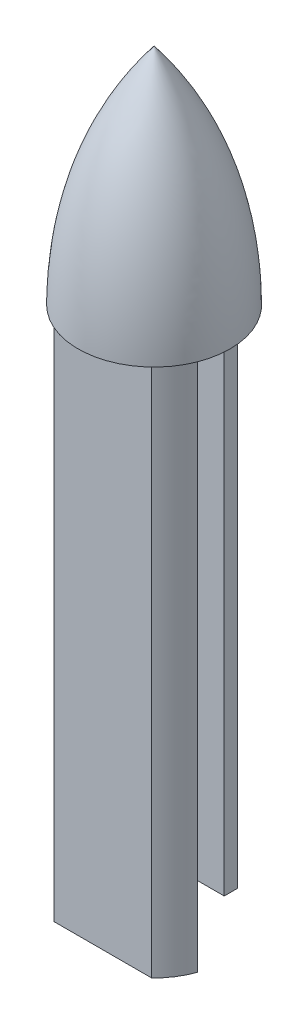
ISO-10303-21;
HEADER;
FILE_DESCRIPTION(('STEP AP214'),'2;1');
FILE_NAME('part.step','',(''),(''),'','','');
FILE_SCHEMA(('AUTOMOTIVE_DESIGN { 1 0 10303 214 1 1 1 1 }'));
ENDSEC;
DATA;
#1=APPLICATION_CONTEXT('core data for automotive mechanical design processes');
#2=APPLICATION_PROTOCOL_DEFINITION('international standard','automotive_design',2000,#1);
#3=PRODUCT_CONTEXT('',#1,'mechanical');
#4=PRODUCT('Part','Part','',(#3));
#5=PRODUCT_RELATED_PRODUCT_CATEGORY('part','',(#4));
#6=PRODUCT_DEFINITION_FORMATION('','',#4);
#7=PRODUCT_DEFINITION_CONTEXT('part definition',#1,'design');
#8=PRODUCT_DEFINITION('design','',#6,#7);
#9=PRODUCT_DEFINITION_SHAPE('','',#8);
#10=(LENGTH_UNIT() NAMED_UNIT(*) SI_UNIT(.MILLI.,.METRE.));
#11=(NAMED_UNIT(*) PLANE_ANGLE_UNIT() SI_UNIT($,.RADIAN.));
#12=(NAMED_UNIT(*) SI_UNIT($,.STERADIAN.) SOLID_ANGLE_UNIT());
#13=UNCERTAINTY_MEASURE_WITH_UNIT(LENGTH_MEASURE(1.E-05),#10,'distance_accuracy_value','');
#14=(GEOMETRIC_REPRESENTATION_CONTEXT(3) GLOBAL_UNCERTAINTY_ASSIGNED_CONTEXT((#13)) GLOBAL_UNIT_ASSIGNED_CONTEXT((#10,
#11,#12)) REPRESENTATION_CONTEXT('',''));
#15=CARTESIAN_POINT('',(0.,0.,0.));
#16=DIRECTION('',(0.,0.,1.));
#17=DIRECTION('',(1.,0.,0.));
#18=AXIS2_PLACEMENT_3D('',#15,#16,#17);
#19=CARTESIAN_POINT('',(0.,-190.,0.));
#20=DIRECTION('',(0.,1.,0.));
#21=DIRECTION('',(0.,0.,1.));
#22=AXIS2_PLACEMENT_3D('',#19,#20,#21);
#23=CYLINDRICAL_SURFACE('',#22,25.2);
#24=CARTESIAN_POINT('',(0.,-190.,0.));
#25=DIRECTION('',(0.,-1.,0.));
#26=DIRECTION('',(0.,0.,-1.));
#27=AXIS2_PLACEMENT_3D('',#24,#25,#26);
#28=CIRCLE('',#27,25.2);
#29=CARTESIAN_POINT('',(-17.3774998201698,-190.,18.25));
#30=VERTEX_POINT('',#29);
#31=CARTESIAN_POINT('',(-23.8112893393029,-190.,8.24999999999999));
#32=VERTEX_POINT('',#31);
#33=EDGE_CURVE('E127',#30,#32,#28,.T.);
#34=ORIENTED_EDGE('',*,*,#33,.F.);
#35=DIRECTION('',(0.,-1.,0.));
#36=VECTOR('',#35,1.);
#37=CARTESIAN_POINT('',(-17.3774998201698,60.214581284378,18.25));
#38=LINE('',#37,#36);
#39=CARTESIAN_POINT('',(-17.3774998201698,0.,18.25));
#40=VERTEX_POINT('',#39);
#41=EDGE_CURVE('E56',#40,#30,#38,.T.);
#42=ORIENTED_EDGE('',*,*,#41,.F.);
#43=CARTESIAN_POINT('',(0.,0.,0.));
#44=DIRECTION('',(0.,-1.,0.));
#45=DIRECTION('',(0.,0.,-1.));
#46=AXIS2_PLACEMENT_3D('',#43,#44,#45);
#47=CIRCLE('',#46,25.2);
#48=CARTESIAN_POINT('',(-23.8112893393029,0.,8.24999999999999));
#49=VERTEX_POINT('',#48);
#50=EDGE_CURVE('E137',#40,#49,#47,.T.);
#51=ORIENTED_EDGE('',*,*,#50,.T.);
#52=DIRECTION('',(0.,-1.,0.));
#53=VECTOR('',#52,1.);
#54=CARTESIAN_POINT('',(-23.8112893393029,60.214581284378,8.24999999999999));
#55=LINE('',#54,#53);
#56=EDGE_CURVE('E163',#49,#32,#55,.T.);
#57=ORIENTED_EDGE('',*,*,#56,.T.);
#58=EDGE_LOOP('',(#34,#42,#51,#57));
#59=FACE_BOUND('',#58,.T.);
#60=ADVANCED_FACE('F41',(#59),#23,.T.);
#61=DIRECTION('',(0.,-1.,0.));
#62=VECTOR('',#61,1.);
#63=CARTESIAN_POINT('',(-5.,60.214581284378,-24.6989878335125));
#64=LINE('',#63,#62);
#65=CARTESIAN_POINT('',(-5.,0.,-24.6989878335125));
#66=VERTEX_POINT('',#65);
#67=CARTESIAN_POINT('',(-5.,-190.,-24.6989878335125));
#68=VERTEX_POINT('',#67);
#69=EDGE_CURVE('E162',#66,#68,#64,.T.);
#70=ORIENTED_EDGE('',*,*,#69,.F.);
#71=CARTESIAN_POINT('',(5.00000000000001,0.,-24.6989878335125));
#72=VERTEX_POINT('',#71);
#73=EDGE_CURVE('E138',#66,#72,#47,.T.);
#74=ORIENTED_EDGE('',*,*,#73,.T.);
#75=DIRECTION('',(0.,-1.,0.));
#76=VECTOR('',#75,1.);
#77=CARTESIAN_POINT('',(5.00000000000001,60.214581284378,-24.6989878335125));
#78=LINE('',#77,#76);
#79=CARTESIAN_POINT('',(5.00000000000001,-190.,-24.6989878335125));
#80=VERTEX_POINT('',#79);
#81=EDGE_CURVE('E167',#72,#80,#78,.T.);
#82=ORIENTED_EDGE('',*,*,#81,.T.);
#83=EDGE_CURVE('E129',#68,#80,#28,.T.);
#84=ORIENTED_EDGE('',*,*,#83,.F.);
#85=EDGE_LOOP('',(#70,#74,#82,#84));
#86=FACE_BOUND('',#85,.T.);
#87=ADVANCED_FACE('F182',(#86),#23,.T.);
#88=CARTESIAN_POINT('',(0.,-190.,0.));
#89=DIRECTION('',(0.,-1.,0.));
#90=DIRECTION('',(0.,0.,-1.));
#91=AXIS2_PLACEMENT_3D('',#88,#89,#90);
#92=PLANE('',#91);
#93=DIRECTION('',(1.,0.,0.));
#94=VECTOR('',#93,1.);
#95=CARTESIAN_POINT('',(0.,-190.,-20.));
#96=LINE('',#95,#94);
#97=CARTESIAN_POINT('',(-5.,-190.,-20.));
#98=VERTEX_POINT('',#97);
#99=CARTESIAN_POINT('',(5.00000000000001,-190.,-20.));
#100=VERTEX_POINT('',#99);
#101=EDGE_CURVE('E156',#98,#100,#96,.T.);
#102=ORIENTED_EDGE('',*,*,#101,.F.);
#103=DIRECTION('',(0.,0.,-1.));
#104=VECTOR('',#103,1.);
#105=CARTESIAN_POINT('',(-5.00000000000001,-190.,0.));
#106=LINE('',#105,#104);
#107=EDGE_CURVE('E154',#98,#68,#106,.T.);
#108=ORIENTED_EDGE('',*,*,#107,.T.);
#109=ORIENTED_EDGE('',*,*,#83,.T.);
#110=DIRECTION('',(0.,0.,-1.));
#111=VECTOR('',#110,1.);
#112=CARTESIAN_POINT('',(5.00000000000001,-190.,0.));
#113=LINE('',#112,#111);
#114=EDGE_CURVE('E159',#100,#80,#113,.T.);
#115=ORIENTED_EDGE('',*,*,#114,.F.);
#116=EDGE_LOOP('',(#102,#108,#109,#115));
#117=FACE_BOUND('',#116,.T.);
#118=ADVANCED_FACE('F187',(#117),#92,.T.);
#119=CARTESIAN_POINT('',(0.,0.,0.));
#120=DIRECTION('',(0.,-1.,0.));
#121=DIRECTION('',(0.,0.,-1.));
#122=AXIS2_PLACEMENT_3D('',#119,#120,#121);
#123=PLANE('',#122);
#124=CARTESIAN_POINT('',(23.8112893393029,0.,8.24999999999999));
#125=VERTEX_POINT('',#124);
#126=CARTESIAN_POINT('',(17.3774998201698,0.,18.25));
#127=VERTEX_POINT('',#126);
#128=EDGE_CURVE('E122',#125,#127,#47,.T.);
#129=ORIENTED_EDGE('',*,*,#128,.F.);
#130=DIRECTION('',(1.,0.,0.));
#131=VECTOR('',#130,1.);
#132=CARTESIAN_POINT('',(0.,0.,8.24999999999999));
#133=LINE('',#132,#131);
#134=EDGE_CURVE('E115',#49,#125,#133,.T.);
#135=ORIENTED_EDGE('',*,*,#134,.F.);
#136=ORIENTED_EDGE('',*,*,#50,.F.);
#137=DIRECTION('',(-1.,0.,0.));
#138=VECTOR('',#137,1.);
#139=CARTESIAN_POINT('',(0.,0.,18.25));
#140=LINE('',#139,#138);
#141=EDGE_CURVE('E123',#127,#40,#140,.T.);
#142=ORIENTED_EDGE('',*,*,#141,.F.);
#143=EDGE_LOOP('',(#129,#135,#136,#142));
#144=FACE_BOUND('',#143,.T.);
#145=DIRECTION('',(0.,0.,1.));
#146=VECTOR('',#145,1.);
#147=CARTESIAN_POINT('',(5.00000000000001,0.,0.));
#148=LINE('',#147,#146);
#149=CARTESIAN_POINT('',(5.00000000000001,0.,-20.));
#150=VERTEX_POINT('',#149);
#151=EDGE_CURVE('E150',#72,#150,#148,.T.);
#152=ORIENTED_EDGE('',*,*,#151,.F.);
#153=ORIENTED_EDGE('',*,*,#73,.F.);
#154=DIRECTION('',(0.,0.,1.));
#155=VECTOR('',#154,1.);
#156=CARTESIAN_POINT('',(-5.00000000000001,0.,0.));
#157=LINE('',#156,#155);
#158=CARTESIAN_POINT('',(-5.,0.,-20.));
#159=VERTEX_POINT('',#158);
#160=EDGE_CURVE('E151',#66,#159,#157,.T.);
#161=ORIENTED_EDGE('',*,*,#160,.T.);
#162=DIRECTION('',(-1.,0.,0.));
#163=VECTOR('',#162,1.);
#164=CARTESIAN_POINT('',(0.,0.,-20.));
#165=LINE('',#164,#163);
#166=EDGE_CURVE('E148',#150,#159,#165,.T.);
#167=ORIENTED_EDGE('',*,*,#166,.F.);
#168=EDGE_LOOP('',(#152,#153,#161,#167));
#169=FACE_BOUND('',#168,.T.);
#170=CARTESIAN_POINT('',(0.,0.,0.));
#171=DIRECTION('',(0.,-1.,0.));
#172=DIRECTION('',(0.,0.,-1.));
#173=AXIS2_PLACEMENT_3D('',#170,#171,#172);
#174=CIRCLE('',#173,27.1);
#175=CARTESIAN_POINT('',(0.,0.,-27.1));
#176=VERTEX_POINT('',#175);
#177=EDGE_CURVE('E11',#176,#176,#174,.T.);
#178=ORIENTED_EDGE('',*,*,#177,.T.);
#179=EDGE_LOOP('',(#178));
#180=FACE_BOUND('',#179,.T.);
#181=ADVANCED_FACE('F43',(#144,#169,#180),#123,.T.);
#182=CARTESIAN_POINT('',(27.1,0.,0.));
#183=CARTESIAN_POINT('',(26.8413015248574,45.5817375307388,0.));
#184=CARTESIAN_POINT('',(0.,80.,0.));
#185=B_SPLINE_CURVE_WITH_KNOTS('',2,(#182,#183,#184),.UNSPECIFIED.,.F.,.F.,(3,3),(0.,1.),.UNSPECIFIED.);
#186=CARTESIAN_POINT('',(0.,0.,0.));
#187=DIRECTION('',(0.,-1.,0.));
#188=AXIS1_PLACEMENT('',#186,#187);
#189=SURFACE_OF_REVOLUTION('',#185,#188);
#190=CARTESIAN_POINT('',(0.,80.,0.));
#191=VERTEX_POINT('',#190);
#192=VERTEX_LOOP('',#191);
#193=FACE_BOUND('',#192,.T.);
#194=ORIENTED_EDGE('',*,*,#177,.F.);
#195=EDGE_LOOP('',(#194));
#196=FACE_BOUND('',#195,.T.);
#197=ADVANCED_FACE('F207',(#193,#196),#189,.F.);
#198=ORIENTED_EDGE('',*,*,#128,.T.);
#199=DIRECTION('',(0.,-1.,0.));
#200=VECTOR('',#199,1.);
#201=CARTESIAN_POINT('',(17.3774998201698,60.214581284378,18.25));
#202=LINE('',#201,#200);
#203=CARTESIAN_POINT('',(17.3774998201698,-190.,18.25));
#204=VERTEX_POINT('',#203);
#205=EDGE_CURVE('E109',#127,#204,#202,.T.);
#206=ORIENTED_EDGE('',*,*,#205,.T.);
#207=CARTESIAN_POINT('',(23.8112893393029,-190.,8.24999999999999));
#208=VERTEX_POINT('',#207);
#209=EDGE_CURVE('E49',#208,#204,#28,.T.);
#210=ORIENTED_EDGE('',*,*,#209,.F.);
#211=DIRECTION('',(0.,-1.,0.));
#212=VECTOR('',#211,1.);
#213=CARTESIAN_POINT('',(23.8112893393029,60.214581284378,8.24999999999999));
#214=LINE('',#213,#212);
#215=EDGE_CURVE('E64',#125,#208,#214,.T.);
#216=ORIENTED_EDGE('',*,*,#215,.F.);
#217=EDGE_LOOP('',(#198,#206,#210,#216));
#218=FACE_BOUND('',#217,.T.);
#219=ADVANCED_FACE('F120',(#218),#23,.T.);
#220=DIRECTION('',(1.,0.,0.));
#221=VECTOR('',#220,1.);
#222=CARTESIAN_POINT('',(0.,-190.,18.25));
#223=LINE('',#222,#221);
#224=EDGE_CURVE('E106',#30,#204,#223,.T.);
#225=ORIENTED_EDGE('',*,*,#224,.F.);
#226=ORIENTED_EDGE('',*,*,#33,.T.);
#227=DIRECTION('',(-1.,0.,0.));
#228=VECTOR('',#227,1.);
#229=CARTESIAN_POINT('',(0.,-190.,8.24999999999999));
#230=LINE('',#229,#228);
#231=EDGE_CURVE('E126',#208,#32,#230,.T.);
#232=ORIENTED_EDGE('',*,*,#231,.F.);
#233=ORIENTED_EDGE('',*,*,#209,.T.);
#234=EDGE_LOOP('',(#225,#226,#232,#233));
#235=FACE_BOUND('',#234,.T.);
#236=ADVANCED_FACE('F125',(#235),#92,.T.);
#237=CARTESIAN_POINT('',(-5.00000000000001,60.214581284378,0.));
#238=DIRECTION('',(-1.,0.,0.));
#239=DIRECTION('',(0.,0.,1.));
#240=AXIS2_PLACEMENT_3D('',#237,#238,#239);
#241=PLANE('',#240);
#242=ORIENTED_EDGE('',*,*,#69,.T.);
#243=ORIENTED_EDGE('',*,*,#107,.F.);
#244=DIRECTION('',(0.,-1.,0.));
#245=VECTOR('',#244,1.);
#246=CARTESIAN_POINT('',(-5.,60.214581284378,-20.));
#247=LINE('',#246,#245);
#248=EDGE_CURVE('E171',#159,#98,#247,.T.);
#249=ORIENTED_EDGE('',*,*,#248,.F.);
#250=ORIENTED_EDGE('',*,*,#160,.F.);
#251=EDGE_LOOP('',(#242,#243,#249,#250));
#252=FACE_BOUND('',#251,.T.);
#253=ADVANCED_FACE('F180',(#252),#241,.T.);
#254=CARTESIAN_POINT('',(0.,60.214581284378,-20.));
#255=DIRECTION('',(0.,0.,-1.));
#256=DIRECTION('',(-1.,0.,0.));
#257=AXIS2_PLACEMENT_3D('',#254,#255,#256);
#258=PLANE('',#257);
#259=ORIENTED_EDGE('',*,*,#166,.T.);
#260=ORIENTED_EDGE('',*,*,#248,.T.);
#261=ORIENTED_EDGE('',*,*,#101,.T.);
#262=DIRECTION('',(0.,-1.,0.));
#263=VECTOR('',#262,1.);
#264=CARTESIAN_POINT('',(5.00000000000001,60.214581284378,-20.));
#265=LINE('',#264,#263);
#266=EDGE_CURVE('E169',#150,#100,#265,.T.);
#267=ORIENTED_EDGE('',*,*,#266,.F.);
#268=EDGE_LOOP('',(#259,#260,#261,#267));
#269=FACE_BOUND('',#268,.T.);
#270=ADVANCED_FACE('F189',(#269),#258,.F.);
#271=CARTESIAN_POINT('',(5.00000000000001,60.214581284378,0.));
#272=DIRECTION('',(-1.,0.,0.));
#273=DIRECTION('',(0.,0.,1.));
#274=AXIS2_PLACEMENT_3D('',#271,#272,#273);
#275=PLANE('',#274);
#276=ORIENTED_EDGE('',*,*,#151,.T.);
#277=ORIENTED_EDGE('',*,*,#266,.T.);
#278=ORIENTED_EDGE('',*,*,#114,.T.);
#279=ORIENTED_EDGE('',*,*,#81,.F.);
#280=EDGE_LOOP('',(#276,#277,#278,#279));
#281=FACE_BOUND('',#280,.T.);
#282=ADVANCED_FACE('F184',(#281),#275,.F.);
#283=CARTESIAN_POINT('',(0.,60.214581284378,8.24999999999999));
#284=DIRECTION('',(0.,0.,1.));
#285=DIRECTION('',(1.,0.,0.));
#286=AXIS2_PLACEMENT_3D('',#283,#284,#285);
#287=PLANE('',#286);
#288=ORIENTED_EDGE('',*,*,#134,.T.);
#289=ORIENTED_EDGE('',*,*,#215,.T.);
#290=ORIENTED_EDGE('',*,*,#231,.T.);
#291=ORIENTED_EDGE('',*,*,#56,.F.);
#292=EDGE_LOOP('',(#288,#289,#290,#291));
#293=FACE_BOUND('',#292,.T.);
#294=ADVANCED_FACE('F196',(#293),#287,.F.);
#295=CARTESIAN_POINT('',(0.,60.214581284378,18.25));
#296=DIRECTION('',(0.,0.,-1.));
#297=DIRECTION('',(-1.,0.,0.));
#298=AXIS2_PLACEMENT_3D('',#295,#296,#297);
#299=PLANE('',#298);
#300=ORIENTED_EDGE('',*,*,#141,.T.);
#301=ORIENTED_EDGE('',*,*,#41,.T.);
#302=ORIENTED_EDGE('',*,*,#224,.T.);
#303=ORIENTED_EDGE('',*,*,#205,.F.);
#304=EDGE_LOOP('',(#300,#301,#302,#303));
#305=FACE_BOUND('',#304,.T.);
#306=ADVANCED_FACE('F108',(#305),#299,.F.);
#307=CLOSED_SHELL('',(#60,#87,#118,#181,#197,#219,#236,#253,#270,#282,#294,#306));
#308=MANIFOLD_SOLID_BREP('B2',#307);
#309=ADVANCED_BREP_SHAPE_REPRESENTATION('',(#18,#308),#14);
#310=SHAPE_DEFINITION_REPRESENTATION(#9,#309);
ENDSEC;
END-ISO-10303-21;
